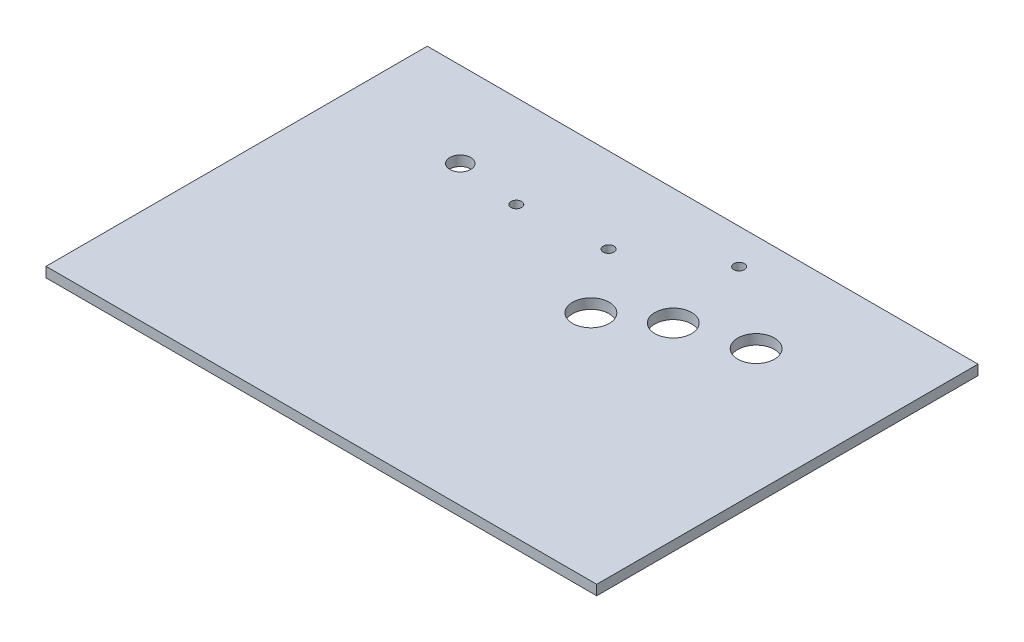
ISO-10303-21;
HEADER;
FILE_DESCRIPTION(('STEP AP214'),'2;1');
FILE_NAME('part.step','',(''),(''),'','','');
FILE_SCHEMA(('AUTOMOTIVE_DESIGN { 1 0 10303 214 1 1 1 1 }'));
ENDSEC;
DATA;
#1=APPLICATION_CONTEXT('core data for automotive mechanical design processes');
#2=APPLICATION_PROTOCOL_DEFINITION('international standard','automotive_design',2000,#1);
#3=PRODUCT_CONTEXT('',#1,'mechanical');
#4=PRODUCT('Part','Part','',(#3));
#5=PRODUCT_RELATED_PRODUCT_CATEGORY('part','',(#4));
#6=PRODUCT_DEFINITION_FORMATION('','',#4);
#7=PRODUCT_DEFINITION_CONTEXT('part definition',#1,'design');
#8=PRODUCT_DEFINITION('design','',#6,#7);
#9=PRODUCT_DEFINITION_SHAPE('','',#8);
#10=(LENGTH_UNIT() NAMED_UNIT(*) SI_UNIT(.MILLI.,.METRE.));
#11=(NAMED_UNIT(*) PLANE_ANGLE_UNIT() SI_UNIT($,.RADIAN.));
#12=(NAMED_UNIT(*) SI_UNIT($,.STERADIAN.) SOLID_ANGLE_UNIT());
#13=UNCERTAINTY_MEASURE_WITH_UNIT(LENGTH_MEASURE(1.E-05),#10,'distance_accuracy_value','');
#14=(GEOMETRIC_REPRESENTATION_CONTEXT(3) GLOBAL_UNCERTAINTY_ASSIGNED_CONTEXT((#13)) GLOBAL_UNIT_ASSIGNED_CONTEXT((#10,
#11,#12)) REPRESENTATION_CONTEXT('',''));
#15=CARTESIAN_POINT('',(0.,0.,0.));
#16=DIRECTION('',(0.,0.,1.));
#17=DIRECTION('',(1.,0.,0.));
#18=AXIS2_PLACEMENT_3D('',#15,#16,#17);
#19=CARTESIAN_POINT('',(0.,6.,0.));
#20=DIRECTION('',(1.,0.,0.));
#21=DIRECTION('',(0.,0.,-1.));
#22=AXIS2_PLACEMENT_3D('',#19,#20,#21);
#23=PLANE('',#22);
#24=DIRECTION('',(0.,0.,1.));
#25=VECTOR('',#24,1.);
#26=CARTESIAN_POINT('',(0.,0.,0.));
#27=LINE('',#26,#25);
#28=CARTESIAN_POINT('',(0.,0.,-228.6));
#29=VERTEX_POINT('',#28);
#30=CARTESIAN_POINT('',(0.,0.,0.));
#31=VERTEX_POINT('',#30);
#32=EDGE_CURVE('E104',#29,#31,#27,.T.);
#33=ORIENTED_EDGE('',*,*,#32,.T.);
#34=DIRECTION('',(0.,-1.,0.));
#35=VECTOR('',#34,1.);
#36=CARTESIAN_POINT('',(0.,6.,0.));
#37=LINE('',#36,#35);
#38=CARTESIAN_POINT('',(0.,6.,0.));
#39=VERTEX_POINT('',#38);
#40=EDGE_CURVE('E12',#39,#31,#37,.T.);
#41=ORIENTED_EDGE('',*,*,#40,.F.);
#42=DIRECTION('',(0.,0.,1.));
#43=VECTOR('',#42,1.);
#44=CARTESIAN_POINT('',(0.,6.,0.));
#45=LINE('',#44,#43);
#46=CARTESIAN_POINT('',(0.,6.,-228.6));
#47=VERTEX_POINT('',#46);
#48=EDGE_CURVE('E92',#47,#39,#45,.T.);
#49=ORIENTED_EDGE('',*,*,#48,.F.);
#50=DIRECTION('',(0.,-1.,0.));
#51=VECTOR('',#50,1.);
#52=CARTESIAN_POINT('',(0.,6.,-228.6));
#53=LINE('',#52,#51);
#54=EDGE_CURVE('E100',#47,#29,#53,.T.);
#55=ORIENTED_EDGE('',*,*,#54,.T.);
#56=EDGE_LOOP('',(#33,#41,#49,#55));
#57=FACE_BOUND('',#56,.T.);
#58=ADVANCED_FACE('F41',(#57),#23,.F.);
#59=CARTESIAN_POINT('',(0.,6.,0.));
#60=DIRECTION('',(0.,0.,-1.));
#61=DIRECTION('',(-1.,0.,0.));
#62=AXIS2_PLACEMENT_3D('',#59,#60,#61);
#63=PLANE('',#62);
#64=DIRECTION('',(1.,0.,0.));
#65=VECTOR('',#64,1.);
#66=CARTESIAN_POINT('',(0.,0.,0.));
#67=LINE('',#66,#65);
#68=CARTESIAN_POINT('',(330.2,0.,0.));
#69=VERTEX_POINT('',#68);
#70=EDGE_CURVE('E96',#31,#69,#67,.T.);
#71=ORIENTED_EDGE('',*,*,#70,.T.);
#72=DIRECTION('',(0.,-1.,0.));
#73=VECTOR('',#72,1.);
#74=CARTESIAN_POINT('',(330.2,6.,0.));
#75=LINE('',#74,#73);
#76=CARTESIAN_POINT('',(330.2,6.,0.));
#77=VERTEX_POINT('',#76);
#78=EDGE_CURVE('E49',#77,#69,#75,.T.);
#79=ORIENTED_EDGE('',*,*,#78,.F.);
#80=DIRECTION('',(1.,0.,0.));
#81=VECTOR('',#80,1.);
#82=CARTESIAN_POINT('',(0.,6.,0.));
#83=LINE('',#82,#81);
#84=EDGE_CURVE('E87',#39,#77,#83,.T.);
#85=ORIENTED_EDGE('',*,*,#84,.F.);
#86=ORIENTED_EDGE('',*,*,#40,.T.);
#87=EDGE_LOOP('',(#71,#79,#85,#86));
#88=FACE_BOUND('',#87,.T.);
#89=ADVANCED_FACE('F95',(#88),#63,.F.);
#90=CARTESIAN_POINT('',(330.2,6.,0.));
#91=DIRECTION('',(-1.,0.,0.));
#92=DIRECTION('',(0.,0.,1.));
#93=AXIS2_PLACEMENT_3D('',#90,#91,#92);
#94=PLANE('',#93);
#95=DIRECTION('',(0.,0.,-1.));
#96=VECTOR('',#95,1.);
#97=CARTESIAN_POINT('',(330.2,0.,0.));
#98=LINE('',#97,#96);
#99=CARTESIAN_POINT('',(330.2,0.,-228.6));
#100=VERTEX_POINT('',#99);
#101=EDGE_CURVE('E74',#69,#100,#98,.T.);
#102=ORIENTED_EDGE('',*,*,#101,.T.);
#103=DIRECTION('',(0.,-1.,0.));
#104=VECTOR('',#103,1.);
#105=CARTESIAN_POINT('',(330.2,6.,-228.6));
#106=LINE('',#105,#104);
#107=CARTESIAN_POINT('',(330.2,6.,-228.6));
#108=VERTEX_POINT('',#107);
#109=EDGE_CURVE('E97',#108,#100,#106,.T.);
#110=ORIENTED_EDGE('',*,*,#109,.F.);
#111=DIRECTION('',(0.,0.,-1.));
#112=VECTOR('',#111,1.);
#113=CARTESIAN_POINT('',(330.2,6.,0.));
#114=LINE('',#113,#112);
#115=EDGE_CURVE('E90',#77,#108,#114,.T.);
#116=ORIENTED_EDGE('',*,*,#115,.F.);
#117=ORIENTED_EDGE('',*,*,#78,.T.);
#118=EDGE_LOOP('',(#102,#110,#116,#117));
#119=FACE_BOUND('',#118,.T.);
#120=ADVANCED_FACE('F98',(#119),#94,.F.);
#121=CARTESIAN_POINT('',(0.,6.,-228.6));
#122=DIRECTION('',(0.,0.,1.));
#123=DIRECTION('',(1.,0.,0.));
#124=AXIS2_PLACEMENT_3D('',#121,#122,#123);
#125=PLANE('',#124);
#126=DIRECTION('',(-1.,0.,0.));
#127=VECTOR('',#126,1.);
#128=CARTESIAN_POINT('',(0.,0.,-228.6));
#129=LINE('',#128,#127);
#130=EDGE_CURVE('E80',#100,#29,#129,.T.);
#131=ORIENTED_EDGE('',*,*,#130,.T.);
#132=ORIENTED_EDGE('',*,*,#54,.F.);
#133=DIRECTION('',(-1.,0.,0.));
#134=VECTOR('',#133,1.);
#135=CARTESIAN_POINT('',(0.,6.,-228.6));
#136=LINE('',#135,#134);
#137=EDGE_CURVE('E57',#108,#47,#136,.T.);
#138=ORIENTED_EDGE('',*,*,#137,.F.);
#139=ORIENTED_EDGE('',*,*,#109,.T.);
#140=EDGE_LOOP('',(#131,#132,#138,#139));
#141=FACE_BOUND('',#140,.T.);
#142=ADVANCED_FACE('F181',(#141),#125,.F.);
#143=CARTESIAN_POINT('',(0.,6.,0.));
#144=DIRECTION('',(0.,-1.,0.));
#145=DIRECTION('',(0.,0.,-1.));
#146=AXIS2_PLACEMENT_3D('',#143,#144,#145);
#147=PLANE('',#146);
#148=CARTESIAN_POINT('',(255.6,6.,-170.18));
#149=DIRECTION('',(0.,1.,0.));
#150=DIRECTION('',(0.,0.,1.));
#151=AXIS2_PLACEMENT_3D('',#148,#149,#150);
#152=CIRCLE('',#151,11.);
#153=CARTESIAN_POINT('',(255.6,6.,-159.18));
#154=VERTEX_POINT('',#153);
#155=EDGE_CURVE('E167',#154,#154,#152,.T.);
#156=ORIENTED_EDGE('',*,*,#155,.F.);
#157=EDGE_LOOP('',(#156));
#158=FACE_BOUND('',#157,.T.);
#159=CARTESIAN_POINT('',(217.5,6.,-158.6));
#160=DIRECTION('',(0.,1.,0.));
#161=DIRECTION('',(0.,0.,1.));
#162=AXIS2_PLACEMENT_3D('',#159,#160,#161);
#163=CIRCLE('',#162,11.);
#164=CARTESIAN_POINT('',(217.5,6.,-147.6));
#165=VERTEX_POINT('',#164);
#166=EDGE_CURVE('E157',#165,#165,#163,.T.);
#167=ORIENTED_EDGE('',*,*,#166,.F.);
#168=EDGE_LOOP('',(#167));
#169=FACE_BOUND('',#168,.T.);
#170=CARTESIAN_POINT('',(187.5,6.,-139.2));
#171=DIRECTION('',(0.,1.,0.));
#172=DIRECTION('',(0.,0.,1.));
#173=AXIS2_PLACEMENT_3D('',#170,#171,#172);
#174=CIRCLE('',#173,11.);
#175=CARTESIAN_POINT('',(187.5,6.,-128.2));
#176=VERTEX_POINT('',#175);
#177=EDGE_CURVE('E156',#176,#176,#174,.T.);
#178=ORIENTED_EDGE('',*,*,#177,.F.);
#179=EDGE_LOOP('',(#178));
#180=FACE_BOUND('',#179,.T.);
#181=CARTESIAN_POINT('',(207.96,6.,-207.6));
#182=DIRECTION('',(0.,1.,0.));
#183=DIRECTION('',(0.,0.,1.));
#184=AXIS2_PLACEMENT_3D('',#181,#182,#183);
#185=CIRCLE('',#184,3.175);
#186=CARTESIAN_POINT('',(207.96,6.,-204.425));
#187=VERTEX_POINT('',#186);
#188=EDGE_CURVE('E144',#187,#187,#185,.T.);
#189=ORIENTED_EDGE('',*,*,#188,.F.);
#190=EDGE_LOOP('',(#189));
#191=FACE_BOUND('',#190,.T.);
#192=CARTESIAN_POINT('',(159.7,6.,-177.6));
#193=DIRECTION('',(0.,1.,0.));
#194=DIRECTION('',(0.,0.,1.));
#195=AXIS2_PLACEMENT_3D('',#192,#193,#194);
#196=CIRCLE('',#195,3.17499999999997);
#197=CARTESIAN_POINT('',(159.7,6.,-174.425));
#198=VERTEX_POINT('',#197);
#199=EDGE_CURVE('E137',#198,#198,#196,.T.);
#200=ORIENTED_EDGE('',*,*,#199,.F.);
#201=EDGE_LOOP('',(#200));
#202=FACE_BOUND('',#201,.T.);
#203=CARTESIAN_POINT('',(108.9,6.,-173.1));
#204=DIRECTION('',(0.,1.,0.));
#205=DIRECTION('',(0.,0.,1.));
#206=AXIS2_PLACEMENT_3D('',#203,#204,#205);
#207=CIRCLE('',#206,3.175);
#208=CARTESIAN_POINT('',(108.9,6.,-169.925));
#209=VERTEX_POINT('',#208);
#210=EDGE_CURVE('E125',#209,#209,#207,.T.);
#211=ORIENTED_EDGE('',*,*,#210,.F.);
#212=EDGE_LOOP('',(#211));
#213=FACE_BOUND('',#212,.T.);
#214=CARTESIAN_POINT('',(70.8,6.,-177.6));
#215=DIRECTION('',(0.,1.,0.));
#216=DIRECTION('',(0.,0.,1.));
#217=AXIS2_PLACEMENT_3D('',#214,#215,#216);
#218=CIRCLE('',#217,6.25);
#219=CARTESIAN_POINT('',(70.8,6.,-171.35));
#220=VERTEX_POINT('',#219);
#221=EDGE_CURVE('E124',#220,#220,#218,.T.);
#222=ORIENTED_EDGE('',*,*,#221,.F.);
#223=EDGE_LOOP('',(#222));
#224=FACE_BOUND('',#223,.T.);
#225=ORIENTED_EDGE('',*,*,#48,.T.);
#226=ORIENTED_EDGE('',*,*,#84,.T.);
#227=ORIENTED_EDGE('',*,*,#115,.T.);
#228=ORIENTED_EDGE('',*,*,#137,.T.);
#229=EDGE_LOOP('',(#225,#226,#227,#228));
#230=FACE_BOUND('',#229,.T.);
#231=ADVANCED_FACE('F88',(#158,#169,#180,#191,#202,#213,#224,#230),#147,.F.);
#232=CARTESIAN_POINT('',(0.,0.,0.));
#233=DIRECTION('',(0.,-1.,0.));
#234=DIRECTION('',(0.,0.,-1.));
#235=AXIS2_PLACEMENT_3D('',#232,#233,#234);
#236=PLANE('',#235);
#237=CARTESIAN_POINT('',(255.6,0.,-170.18));
#238=DIRECTION('',(0.,1.,0.));
#239=DIRECTION('',(0.,0.,1.));
#240=AXIS2_PLACEMENT_3D('',#237,#238,#239);
#241=CIRCLE('',#240,11.);
#242=CARTESIAN_POINT('',(255.6,0.,-159.18));
#243=VERTEX_POINT('',#242);
#244=EDGE_CURVE('E163',#243,#243,#241,.T.);
#245=ORIENTED_EDGE('',*,*,#244,.T.);
#246=EDGE_LOOP('',(#245));
#247=FACE_BOUND('',#246,.T.);
#248=CARTESIAN_POINT('',(217.5,0.,-158.6));
#249=DIRECTION('',(0.,1.,0.));
#250=DIRECTION('',(0.,0.,1.));
#251=AXIS2_PLACEMENT_3D('',#248,#249,#250);
#252=CIRCLE('',#251,11.);
#253=CARTESIAN_POINT('',(217.5,0.,-147.6));
#254=VERTEX_POINT('',#253);
#255=EDGE_CURVE('E159',#254,#254,#252,.T.);
#256=ORIENTED_EDGE('',*,*,#255,.T.);
#257=EDGE_LOOP('',(#256));
#258=FACE_BOUND('',#257,.T.);
#259=CARTESIAN_POINT('',(187.5,0.,-139.2));
#260=DIRECTION('',(0.,1.,0.));
#261=DIRECTION('',(0.,0.,1.));
#262=AXIS2_PLACEMENT_3D('',#259,#260,#261);
#263=CIRCLE('',#262,11.);
#264=CARTESIAN_POINT('',(187.5,0.,-128.2));
#265=VERTEX_POINT('',#264);
#266=EDGE_CURVE('E151',#265,#265,#263,.T.);
#267=ORIENTED_EDGE('',*,*,#266,.T.);
#268=EDGE_LOOP('',(#267));
#269=FACE_BOUND('',#268,.T.);
#270=CARTESIAN_POINT('',(207.96,0.,-207.6));
#271=DIRECTION('',(0.,1.,0.));
#272=DIRECTION('',(0.,0.,1.));
#273=AXIS2_PLACEMENT_3D('',#270,#271,#272);
#274=CIRCLE('',#273,3.175);
#275=CARTESIAN_POINT('',(207.96,0.,-204.425));
#276=VERTEX_POINT('',#275);
#277=EDGE_CURVE('E140',#276,#276,#274,.T.);
#278=ORIENTED_EDGE('',*,*,#277,.T.);
#279=EDGE_LOOP('',(#278));
#280=FACE_BOUND('',#279,.T.);
#281=CARTESIAN_POINT('',(159.7,0.,-177.6));
#282=DIRECTION('',(0.,1.,0.));
#283=DIRECTION('',(0.,0.,1.));
#284=AXIS2_PLACEMENT_3D('',#281,#282,#283);
#285=CIRCLE('',#284,3.17499999999997);
#286=CARTESIAN_POINT('',(159.7,0.,-174.425));
#287=VERTEX_POINT('',#286);
#288=EDGE_CURVE('E134',#287,#287,#285,.T.);
#289=ORIENTED_EDGE('',*,*,#288,.T.);
#290=EDGE_LOOP('',(#289));
#291=FACE_BOUND('',#290,.T.);
#292=CARTESIAN_POINT('',(108.9,0.,-173.1));
#293=DIRECTION('',(0.,1.,0.));
#294=DIRECTION('',(0.,0.,1.));
#295=AXIS2_PLACEMENT_3D('',#292,#293,#294);
#296=CIRCLE('',#295,3.175);
#297=CARTESIAN_POINT('',(108.9,0.,-169.925));
#298=VERTEX_POINT('',#297);
#299=EDGE_CURVE('E127',#298,#298,#296,.T.);
#300=ORIENTED_EDGE('',*,*,#299,.T.);
#301=EDGE_LOOP('',(#300));
#302=FACE_BOUND('',#301,.T.);
#303=CARTESIAN_POINT('',(70.8,0.,-177.6));
#304=DIRECTION('',(0.,1.,0.));
#305=DIRECTION('',(0.,0.,1.));
#306=AXIS2_PLACEMENT_3D('',#303,#304,#305);
#307=CIRCLE('',#306,6.25);
#308=CARTESIAN_POINT('',(70.8,0.,-171.35));
#309=VERTEX_POINT('',#308);
#310=EDGE_CURVE('E106',#309,#309,#307,.T.);
#311=ORIENTED_EDGE('',*,*,#310,.T.);
#312=EDGE_LOOP('',(#311));
#313=FACE_BOUND('',#312,.T.);
#314=ORIENTED_EDGE('',*,*,#32,.F.);
#315=ORIENTED_EDGE('',*,*,#130,.F.);
#316=ORIENTED_EDGE('',*,*,#101,.F.);
#317=ORIENTED_EDGE('',*,*,#70,.F.);
#318=EDGE_LOOP('',(#314,#315,#316,#317));
#319=FACE_BOUND('',#318,.T.);
#320=ADVANCED_FACE('F180',(#247,#258,#269,#280,#291,#302,#313,#319),#236,.T.);
#321=CARTESIAN_POINT('',(70.8,0.,-177.6));
#322=DIRECTION('',(0.,1.,0.));
#323=DIRECTION('',(0.,0.,1.));
#324=AXIS2_PLACEMENT_3D('',#321,#322,#323);
#325=CYLINDRICAL_SURFACE('',#324,6.25);
#326=ORIENTED_EDGE('',*,*,#310,.F.);
#327=EDGE_LOOP('',(#326));
#328=FACE_BOUND('',#327,.T.);
#329=ORIENTED_EDGE('',*,*,#221,.T.);
#330=EDGE_LOOP('',(#329));
#331=FACE_BOUND('',#330,.T.);
#332=ADVANCED_FACE('F197',(#328,#331),#325,.F.);
#333=CARTESIAN_POINT('',(108.9,0.,-173.1));
#334=DIRECTION('',(0.,1.,0.));
#335=DIRECTION('',(0.,0.,1.));
#336=AXIS2_PLACEMENT_3D('',#333,#334,#335);
#337=CYLINDRICAL_SURFACE('',#336,3.175);
#338=ORIENTED_EDGE('',*,*,#299,.F.);
#339=EDGE_LOOP('',(#338));
#340=FACE_BOUND('',#339,.T.);
#341=ORIENTED_EDGE('',*,*,#210,.T.);
#342=EDGE_LOOP('',(#341));
#343=FACE_BOUND('',#342,.T.);
#344=ADVANCED_FACE('F194',(#340,#343),#337,.F.);
#345=CARTESIAN_POINT('',(159.7,0.,-177.6));
#346=DIRECTION('',(0.,1.,0.));
#347=DIRECTION('',(0.,0.,1.));
#348=AXIS2_PLACEMENT_3D('',#345,#346,#347);
#349=CYLINDRICAL_SURFACE('',#348,3.17499999999997);
#350=ORIENTED_EDGE('',*,*,#288,.F.);
#351=EDGE_LOOP('',(#350));
#352=FACE_BOUND('',#351,.T.);
#353=ORIENTED_EDGE('',*,*,#199,.T.);
#354=EDGE_LOOP('',(#353));
#355=FACE_BOUND('',#354,.T.);
#356=ADVANCED_FACE('F196',(#352,#355),#349,.F.);
#357=CARTESIAN_POINT('',(207.96,0.,-207.6));
#358=DIRECTION('',(0.,1.,0.));
#359=DIRECTION('',(0.,0.,1.));
#360=AXIS2_PLACEMENT_3D('',#357,#358,#359);
#361=CYLINDRICAL_SURFACE('',#360,3.175);
#362=ORIENTED_EDGE('',*,*,#277,.F.);
#363=EDGE_LOOP('',(#362));
#364=FACE_BOUND('',#363,.T.);
#365=ORIENTED_EDGE('',*,*,#188,.T.);
#366=EDGE_LOOP('',(#365));
#367=FACE_BOUND('',#366,.T.);
#368=ADVANCED_FACE('F204',(#364,#367),#361,.F.);
#369=CARTESIAN_POINT('',(187.5,0.,-139.2));
#370=DIRECTION('',(0.,1.,0.));
#371=DIRECTION('',(0.,0.,1.));
#372=AXIS2_PLACEMENT_3D('',#369,#370,#371);
#373=CYLINDRICAL_SURFACE('',#372,11.);
#374=ORIENTED_EDGE('',*,*,#266,.F.);
#375=EDGE_LOOP('',(#374));
#376=FACE_BOUND('',#375,.T.);
#377=ORIENTED_EDGE('',*,*,#177,.T.);
#378=EDGE_LOOP('',(#377));
#379=FACE_BOUND('',#378,.T.);
#380=ADVANCED_FACE('F270',(#376,#379),#373,.F.);
#381=CARTESIAN_POINT('',(217.5,0.,-158.6));
#382=DIRECTION('',(0.,1.,0.));
#383=DIRECTION('',(0.,0.,1.));
#384=AXIS2_PLACEMENT_3D('',#381,#382,#383);
#385=CYLINDRICAL_SURFACE('',#384,11.);
#386=ORIENTED_EDGE('',*,*,#255,.F.);
#387=EDGE_LOOP('',(#386));
#388=FACE_BOUND('',#387,.T.);
#389=ORIENTED_EDGE('',*,*,#166,.T.);
#390=EDGE_LOOP('',(#389));
#391=FACE_BOUND('',#390,.T.);
#392=ADVANCED_FACE('F176',(#388,#391),#385,.F.);
#393=CARTESIAN_POINT('',(255.6,0.,-170.18));
#394=DIRECTION('',(0.,1.,0.));
#395=DIRECTION('',(0.,0.,1.));
#396=AXIS2_PLACEMENT_3D('',#393,#394,#395);
#397=CYLINDRICAL_SURFACE('',#396,11.);
#398=ORIENTED_EDGE('',*,*,#244,.F.);
#399=EDGE_LOOP('',(#398));
#400=FACE_BOUND('',#399,.T.);
#401=ORIENTED_EDGE('',*,*,#155,.T.);
#402=EDGE_LOOP('',(#401));
#403=FACE_BOUND('',#402,.T.);
#404=ADVANCED_FACE('F288',(#400,#403),#397,.F.);
#405=CLOSED_SHELL('',(#58,#89,#120,#142,#231,#320,#332,#344,#356,#368,#380,#392,#404));
#406=MANIFOLD_SOLID_BREP('B2',#405);
#407=ADVANCED_BREP_SHAPE_REPRESENTATION('',(#18,#406),#14);
#408=SHAPE_DEFINITION_REPRESENTATION(#9,#407);
ENDSEC;
END-ISO-10303-21;
